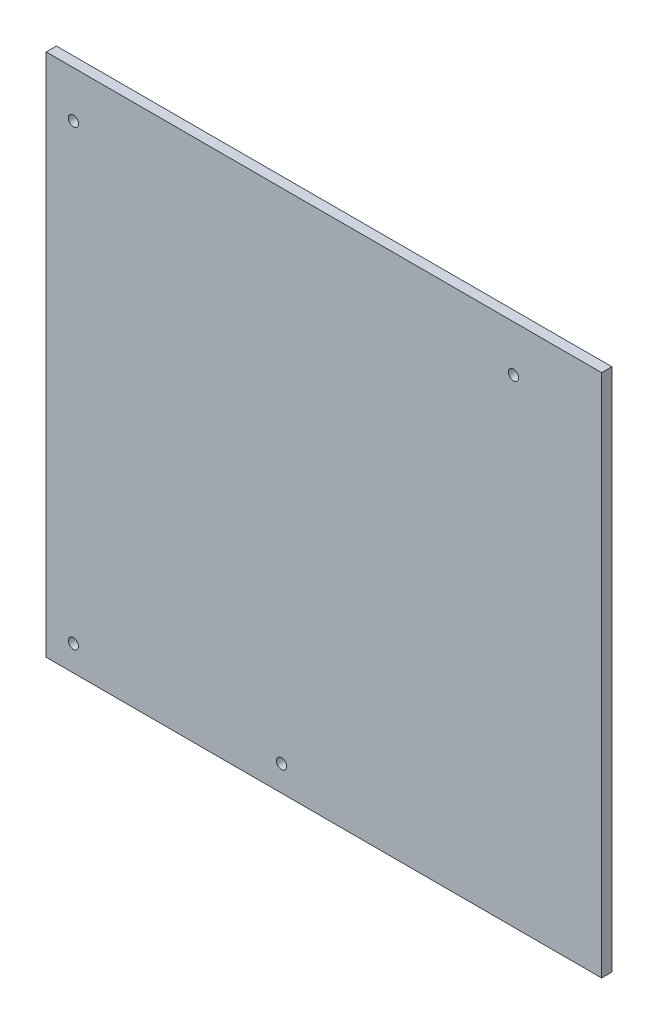
ISO-10303-21;
HEADER;
FILE_DESCRIPTION(('STEP AP214'),'2;1');
FILE_NAME('part.step','',(''),(''),'','','');
FILE_SCHEMA(('AUTOMOTIVE_DESIGN { 1 0 10303 214 1 1 1 1 }'));
ENDSEC;
DATA;
#1=APPLICATION_CONTEXT('core data for automotive mechanical design processes');
#2=APPLICATION_PROTOCOL_DEFINITION('international standard','automotive_design',2000,#1);
#3=PRODUCT_CONTEXT('',#1,'mechanical');
#4=PRODUCT('Part','Part','',(#3));
#5=PRODUCT_RELATED_PRODUCT_CATEGORY('part','',(#4));
#6=PRODUCT_DEFINITION_FORMATION('','',#4);
#7=PRODUCT_DEFINITION_CONTEXT('part definition',#1,'design');
#8=PRODUCT_DEFINITION('design','',#6,#7);
#9=PRODUCT_DEFINITION_SHAPE('','',#8);
#10=(LENGTH_UNIT() NAMED_UNIT(*) SI_UNIT(.MILLI.,.METRE.));
#11=(NAMED_UNIT(*) PLANE_ANGLE_UNIT() SI_UNIT($,.RADIAN.));
#12=(NAMED_UNIT(*) SI_UNIT($,.STERADIAN.) SOLID_ANGLE_UNIT());
#13=UNCERTAINTY_MEASURE_WITH_UNIT(LENGTH_MEASURE(1.E-05),#10,'distance_accuracy_value','');
#14=(GEOMETRIC_REPRESENTATION_CONTEXT(3) GLOBAL_UNCERTAINTY_ASSIGNED_CONTEXT((#13)) GLOBAL_UNIT_ASSIGNED_CONTEXT((#10,
#11,#12)) REPRESENTATION_CONTEXT('',''));
#15=CARTESIAN_POINT('',(0.,0.,0.));
#16=DIRECTION('',(0.,0.,1.));
#17=DIRECTION('',(1.,0.,0.));
#18=AXIS2_PLACEMENT_3D('',#15,#16,#17);
#19=CARTESIAN_POINT('',(0.,0.,3.));
#20=DIRECTION('',(0.,0.,-1.));
#21=DIRECTION('',(-1.,0.,0.));
#22=AXIS2_PLACEMENT_3D('',#19,#20,#21);
#23=PLANE('',#22);
#24=DIRECTION('',(0.,-1.,0.));
#25=VECTOR('',#24,1.);
#26=CARTESIAN_POINT('',(0.,0.,3.));
#27=LINE('',#26,#25);
#28=CARTESIAN_POINT('',(0.,153.6666,3.));
#29=VERTEX_POINT('',#28);
#30=CARTESIAN_POINT('',(0.,0.,3.));
#31=VERTEX_POINT('',#30);
#32=EDGE_CURVE('E89',#29,#31,#27,.T.);
#33=ORIENTED_EDGE('',*,*,#32,.T.);
#34=DIRECTION('',(1.,0.,0.));
#35=VECTOR('',#34,1.);
#36=CARTESIAN_POINT('',(0.,0.,3.));
#37=LINE('',#36,#35);
#38=CARTESIAN_POINT('',(162.83,0.,3.));
#39=VERTEX_POINT('',#38);
#40=EDGE_CURVE('E84',#31,#39,#37,.T.);
#41=ORIENTED_EDGE('',*,*,#40,.T.);
#42=DIRECTION('',(0.,1.,0.));
#43=VECTOR('',#42,1.);
#44=CARTESIAN_POINT('',(162.83,0.,3.));
#45=LINE('',#44,#43);
#46=CARTESIAN_POINT('',(162.83,153.6666,3.));
#47=VERTEX_POINT('',#46);
#48=EDGE_CURVE('E87',#39,#47,#45,.T.);
#49=ORIENTED_EDGE('',*,*,#48,.T.);
#50=DIRECTION('',(-1.,0.,0.));
#51=VECTOR('',#50,1.);
#52=CARTESIAN_POINT('',(0.,153.6666,3.));
#53=LINE('',#52,#51);
#54=EDGE_CURVE('E54',#47,#29,#53,.T.);
#55=ORIENTED_EDGE('',*,*,#54,.T.);
#56=EDGE_LOOP('',(#33,#41,#49,#55));
#57=FACE_BOUND('',#56,.T.);
#58=CARTESIAN_POINT('',(8.,140.1666,3.));
#59=DIRECTION('',(0.,0.,1.));
#60=DIRECTION('',(1.,0.,0.));
#61=AXIS2_PLACEMENT_3D('',#58,#59,#60);
#62=CIRCLE('',#61,1.5);
#63=CARTESIAN_POINT('',(9.5,140.1666,3.));
#64=VERTEX_POINT('',#63);
#65=EDGE_CURVE('E104',#64,#64,#62,.T.);
#66=ORIENTED_EDGE('',*,*,#65,.F.);
#67=EDGE_LOOP('',(#66));
#68=FACE_BOUND('',#67,.T.);
#69=CARTESIAN_POINT('',(137.,140.1666,3.));
#70=DIRECTION('',(0.,0.,1.));
#71=DIRECTION('',(1.,0.,0.));
#72=AXIS2_PLACEMENT_3D('',#69,#70,#71);
#73=CIRCLE('',#72,1.5);
#74=CARTESIAN_POINT('',(138.5,140.1666,3.));
#75=VERTEX_POINT('',#74);
#76=EDGE_CURVE('E119',#75,#75,#73,.T.);
#77=ORIENTED_EDGE('',*,*,#76,.F.);
#78=EDGE_LOOP('',(#77));
#79=FACE_BOUND('',#78,.T.);
#80=CARTESIAN_POINT('',(8.,7.5,3.));
#81=DIRECTION('',(0.,0.,1.));
#82=DIRECTION('',(1.,0.,0.));
#83=AXIS2_PLACEMENT_3D('',#80,#81,#82);
#84=CIRCLE('',#83,1.5);
#85=CARTESIAN_POINT('',(9.5,7.5,3.));
#86=VERTEX_POINT('',#85);
#87=EDGE_CURVE('E125',#86,#86,#84,.T.);
#88=ORIENTED_EDGE('',*,*,#87,.F.);
#89=EDGE_LOOP('',(#88));
#90=FACE_BOUND('',#89,.T.);
#91=CARTESIAN_POINT('',(69.,7.5,3.));
#92=DIRECTION('',(0.,0.,1.));
#93=DIRECTION('',(1.,0.,0.));
#94=AXIS2_PLACEMENT_3D('',#91,#92,#93);
#95=CIRCLE('',#94,1.5);
#96=CARTESIAN_POINT('',(70.5,7.5,3.));
#97=VERTEX_POINT('',#96);
#98=EDGE_CURVE('E131',#97,#97,#95,.T.);
#99=ORIENTED_EDGE('',*,*,#98,.F.);
#100=EDGE_LOOP('',(#99));
#101=FACE_BOUND('',#100,.T.);
#102=ADVANCED_FACE('F37',(#57,#68,#79,#90,#101),#23,.F.);
#103=CARTESIAN_POINT('',(0.,0.,0.));
#104=DIRECTION('',(0.,0.,-1.));
#105=DIRECTION('',(-1.,0.,0.));
#106=AXIS2_PLACEMENT_3D('',#103,#104,#105);
#107=PLANE('',#106);
#108=CARTESIAN_POINT('',(8.,7.5,0.));
#109=DIRECTION('',(0.,0.,1.));
#110=DIRECTION('',(1.,0.,0.));
#111=AXIS2_PLACEMENT_3D('',#108,#109,#110);
#112=CIRCLE('',#111,1.5);
#113=CARTESIAN_POINT('',(9.5,7.5,0.));
#114=VERTEX_POINT('',#113);
#115=EDGE_CURVE('E128',#114,#114,#112,.T.);
#116=ORIENTED_EDGE('',*,*,#115,.T.);
#117=EDGE_LOOP('',(#116));
#118=FACE_BOUND('',#117,.T.);
#119=CARTESIAN_POINT('',(8.,140.1666,0.));
#120=DIRECTION('',(0.,0.,1.));
#121=DIRECTION('',(1.,0.,0.));
#122=AXIS2_PLACEMENT_3D('',#119,#120,#121);
#123=CIRCLE('',#122,1.5);
#124=CARTESIAN_POINT('',(9.5,140.1666,0.));
#125=VERTEX_POINT('',#124);
#126=EDGE_CURVE('E116',#125,#125,#123,.T.);
#127=ORIENTED_EDGE('',*,*,#126,.T.);
#128=EDGE_LOOP('',(#127));
#129=FACE_BOUND('',#128,.T.);
#130=DIRECTION('',(0.,-1.,0.));
#131=VECTOR('',#130,1.);
#132=CARTESIAN_POINT('',(0.,0.,0.));
#133=LINE('',#132,#131);
#134=CARTESIAN_POINT('',(0.,153.6666,0.));
#135=VERTEX_POINT('',#134);
#136=CARTESIAN_POINT('',(0.,0.,0.));
#137=VERTEX_POINT('',#136);
#138=EDGE_CURVE('E101',#135,#137,#133,.T.);
#139=ORIENTED_EDGE('',*,*,#138,.F.);
#140=DIRECTION('',(-1.,0.,0.));
#141=VECTOR('',#140,1.);
#142=CARTESIAN_POINT('',(0.,153.6666,0.));
#143=LINE('',#142,#141);
#144=CARTESIAN_POINT('',(162.83,153.6666,0.));
#145=VERTEX_POINT('',#144);
#146=EDGE_CURVE('E77',#145,#135,#143,.T.);
#147=ORIENTED_EDGE('',*,*,#146,.F.);
#148=DIRECTION('',(0.,1.,0.));
#149=VECTOR('',#148,1.);
#150=CARTESIAN_POINT('',(162.83,0.,0.));
#151=LINE('',#150,#149);
#152=CARTESIAN_POINT('',(162.83,0.,0.));
#153=VERTEX_POINT('',#152);
#154=EDGE_CURVE('E71',#153,#145,#151,.T.);
#155=ORIENTED_EDGE('',*,*,#154,.F.);
#156=DIRECTION('',(1.,0.,0.));
#157=VECTOR('',#156,1.);
#158=CARTESIAN_POINT('',(0.,0.,0.));
#159=LINE('',#158,#157);
#160=EDGE_CURVE('E93',#137,#153,#159,.T.);
#161=ORIENTED_EDGE('',*,*,#160,.F.);
#162=EDGE_LOOP('',(#139,#147,#155,#161));
#163=FACE_BOUND('',#162,.T.);
#164=CARTESIAN_POINT('',(137.,140.1666,0.));
#165=DIRECTION('',(0.,0.,1.));
#166=DIRECTION('',(1.,0.,0.));
#167=AXIS2_PLACEMENT_3D('',#164,#165,#166);
#168=CIRCLE('',#167,1.5);
#169=CARTESIAN_POINT('',(138.5,140.1666,0.));
#170=VERTEX_POINT('',#169);
#171=EDGE_CURVE('E122',#170,#170,#168,.T.);
#172=ORIENTED_EDGE('',*,*,#171,.T.);
#173=EDGE_LOOP('',(#172));
#174=FACE_BOUND('',#173,.T.);
#175=CARTESIAN_POINT('',(69.,7.5,0.));
#176=DIRECTION('',(0.,0.,1.));
#177=DIRECTION('',(1.,0.,0.));
#178=AXIS2_PLACEMENT_3D('',#175,#176,#177);
#179=CIRCLE('',#178,1.5);
#180=CARTESIAN_POINT('',(70.5,7.5,0.));
#181=VERTEX_POINT('',#180);
#182=EDGE_CURVE('E134',#181,#181,#179,.T.);
#183=ORIENTED_EDGE('',*,*,#182,.T.);
#184=EDGE_LOOP('',(#183));
#185=FACE_BOUND('',#184,.T.);
#186=ADVANCED_FACE('F112',(#118,#129,#163,#174,#185),#107,.T.);
#187=CARTESIAN_POINT('',(0.,0.,3.));
#188=DIRECTION('',(1.,0.,0.));
#189=DIRECTION('',(0.,1.,0.));
#190=AXIS2_PLACEMENT_3D('',#187,#188,#189);
#191=PLANE('',#190);
#192=ORIENTED_EDGE('',*,*,#138,.T.);
#193=DIRECTION('',(0.,0.,-1.));
#194=VECTOR('',#193,1.);
#195=CARTESIAN_POINT('',(0.,0.,3.));
#196=LINE('',#195,#194);
#197=EDGE_CURVE('E11',#31,#137,#196,.T.);
#198=ORIENTED_EDGE('',*,*,#197,.F.);
#199=ORIENTED_EDGE('',*,*,#32,.F.);
#200=DIRECTION('',(0.,0.,-1.));
#201=VECTOR('',#200,1.);
#202=CARTESIAN_POINT('',(0.,153.6666,3.));
#203=LINE('',#202,#201);
#204=EDGE_CURVE('E97',#29,#135,#203,.T.);
#205=ORIENTED_EDGE('',*,*,#204,.T.);
#206=EDGE_LOOP('',(#192,#198,#199,#205));
#207=FACE_BOUND('',#206,.T.);
#208=ADVANCED_FACE('F39',(#207),#191,.F.);
#209=CARTESIAN_POINT('',(0.,0.,3.));
#210=DIRECTION('',(0.,1.,0.));
#211=DIRECTION('',(0.,0.,1.));
#212=AXIS2_PLACEMENT_3D('',#209,#210,#211);
#213=PLANE('',#212);
#214=ORIENTED_EDGE('',*,*,#160,.T.);
#215=DIRECTION('',(0.,0.,-1.));
#216=VECTOR('',#215,1.);
#217=CARTESIAN_POINT('',(162.83,0.,3.));
#218=LINE('',#217,#216);
#219=EDGE_CURVE('E46',#39,#153,#218,.T.);
#220=ORIENTED_EDGE('',*,*,#219,.F.);
#221=ORIENTED_EDGE('',*,*,#40,.F.);
#222=ORIENTED_EDGE('',*,*,#197,.T.);
#223=EDGE_LOOP('',(#214,#220,#221,#222));
#224=FACE_BOUND('',#223,.T.);
#225=ADVANCED_FACE('F92',(#224),#213,.F.);
#226=CARTESIAN_POINT('',(162.83,0.,3.));
#227=DIRECTION('',(-1.,0.,0.));
#228=DIRECTION('',(0.,-1.,0.));
#229=AXIS2_PLACEMENT_3D('',#226,#227,#228);
#230=PLANE('',#229);
#231=ORIENTED_EDGE('',*,*,#154,.T.);
#232=DIRECTION('',(0.,0.,-1.));
#233=VECTOR('',#232,1.);
#234=CARTESIAN_POINT('',(162.83,153.6666,3.));
#235=LINE('',#234,#233);
#236=EDGE_CURVE('E94',#47,#145,#235,.T.);
#237=ORIENTED_EDGE('',*,*,#236,.F.);
#238=ORIENTED_EDGE('',*,*,#48,.F.);
#239=ORIENTED_EDGE('',*,*,#219,.T.);
#240=EDGE_LOOP('',(#231,#237,#238,#239));
#241=FACE_BOUND('',#240,.T.);
#242=ADVANCED_FACE('F95',(#241),#230,.F.);
#243=CARTESIAN_POINT('',(0.,153.6666,3.));
#244=DIRECTION('',(0.,-1.,0.));
#245=DIRECTION('',(0.,0.,-1.));
#246=AXIS2_PLACEMENT_3D('',#243,#244,#245);
#247=PLANE('',#246);
#248=ORIENTED_EDGE('',*,*,#146,.T.);
#249=ORIENTED_EDGE('',*,*,#204,.F.);
#250=ORIENTED_EDGE('',*,*,#54,.F.);
#251=ORIENTED_EDGE('',*,*,#236,.T.);
#252=EDGE_LOOP('',(#248,#249,#250,#251));
#253=FACE_BOUND('',#252,.T.);
#254=ADVANCED_FACE('F109',(#253),#247,.F.);
#255=CARTESIAN_POINT('',(8.,140.1666,3.));
#256=DIRECTION('',(0.,0.,-1.));
#257=DIRECTION('',(-1.,0.,0.));
#258=AXIS2_PLACEMENT_3D('',#255,#256,#257);
#259=CYLINDRICAL_SURFACE('',#258,1.5);
#260=ORIENTED_EDGE('',*,*,#65,.T.);
#261=EDGE_LOOP('',(#260));
#262=FACE_BOUND('',#261,.T.);
#263=ORIENTED_EDGE('',*,*,#126,.F.);
#264=EDGE_LOOP('',(#263));
#265=FACE_BOUND('',#264,.T.);
#266=ADVANCED_FACE('F151',(#262,#265),#259,.F.);
#267=CARTESIAN_POINT('',(137.,140.1666,3.));
#268=DIRECTION('',(0.,0.,-1.));
#269=DIRECTION('',(-1.,0.,0.));
#270=AXIS2_PLACEMENT_3D('',#267,#268,#269);
#271=CYLINDRICAL_SURFACE('',#270,1.5);
#272=ORIENTED_EDGE('',*,*,#76,.T.);
#273=EDGE_LOOP('',(#272));
#274=FACE_BOUND('',#273,.T.);
#275=ORIENTED_EDGE('',*,*,#171,.F.);
#276=EDGE_LOOP('',(#275));
#277=FACE_BOUND('',#276,.T.);
#278=ADVANCED_FACE('F197',(#274,#277),#271,.F.);
#279=CARTESIAN_POINT('',(8.,7.5,3.));
#280=DIRECTION('',(0.,0.,-1.));
#281=DIRECTION('',(-1.,0.,0.));
#282=AXIS2_PLACEMENT_3D('',#279,#280,#281);
#283=CYLINDRICAL_SURFACE('',#282,1.5);
#284=ORIENTED_EDGE('',*,*,#87,.T.);
#285=EDGE_LOOP('',(#284));
#286=FACE_BOUND('',#285,.T.);
#287=ORIENTED_EDGE('',*,*,#115,.F.);
#288=EDGE_LOOP('',(#287));
#289=FACE_BOUND('',#288,.T.);
#290=ADVANCED_FACE('F205',(#286,#289),#283,.F.);
#291=CARTESIAN_POINT('',(69.,7.5,3.));
#292=DIRECTION('',(0.,0.,-1.));
#293=DIRECTION('',(-1.,0.,0.));
#294=AXIS2_PLACEMENT_3D('',#291,#292,#293);
#295=CYLINDRICAL_SURFACE('',#294,1.5);
#296=ORIENTED_EDGE('',*,*,#98,.T.);
#297=EDGE_LOOP('',(#296));
#298=FACE_BOUND('',#297,.T.);
#299=ORIENTED_EDGE('',*,*,#182,.F.);
#300=EDGE_LOOP('',(#299));
#301=FACE_BOUND('',#300,.T.);
#302=ADVANCED_FACE('F140',(#298,#301),#295,.F.);
#303=CLOSED_SHELL('',(#102,#186,#208,#225,#242,#254,#266,#278,#290,#302));
#304=MANIFOLD_SOLID_BREP('B2',#303);
#305=ADVANCED_BREP_SHAPE_REPRESENTATION('',(#18,#304),#14);
#306=SHAPE_DEFINITION_REPRESENTATION(#9,#305);
ENDSEC;
END-ISO-10303-21;
